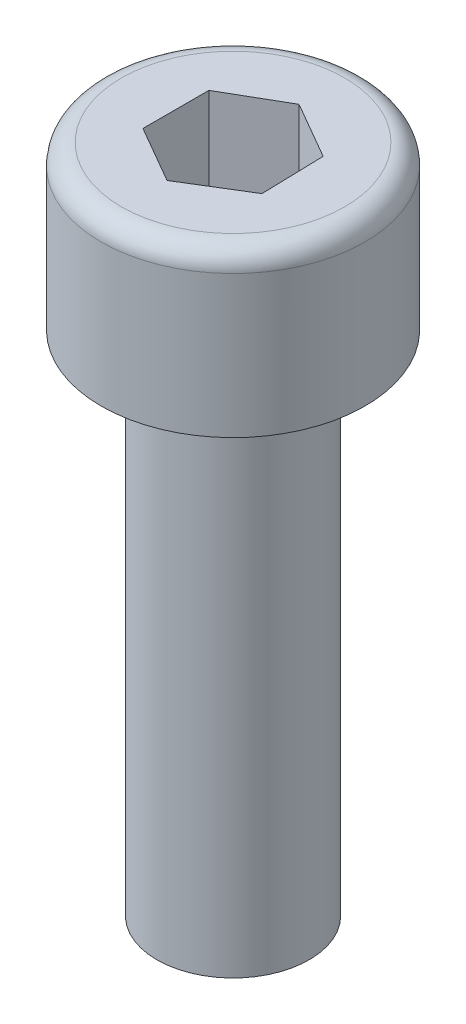
ISO-10303-21;
HEADER;
FILE_DESCRIPTION(('STEP AP214'),'2;1');
FILE_NAME('part.step','',(''),(''),'','','');
FILE_SCHEMA(('AUTOMOTIVE_DESIGN { 1 0 10303 214 1 1 1 1 }'));
ENDSEC;
DATA;
#1=APPLICATION_CONTEXT('core data for automotive mechanical design processes');
#2=APPLICATION_PROTOCOL_DEFINITION('international standard','automotive_design',2000,#1);
#3=PRODUCT_CONTEXT('',#1,'mechanical');
#4=PRODUCT('Part','Part','',(#3));
#5=PRODUCT_RELATED_PRODUCT_CATEGORY('part','',(#4));
#6=PRODUCT_DEFINITION_FORMATION('','',#4);
#7=PRODUCT_DEFINITION_CONTEXT('part definition',#1,'design');
#8=PRODUCT_DEFINITION('design','',#6,#7);
#9=PRODUCT_DEFINITION_SHAPE('','',#8);
#10=(LENGTH_UNIT() NAMED_UNIT(*) SI_UNIT(.MILLI.,.METRE.));
#11=(NAMED_UNIT(*) PLANE_ANGLE_UNIT() SI_UNIT($,.RADIAN.));
#12=(NAMED_UNIT(*) SI_UNIT($,.STERADIAN.) SOLID_ANGLE_UNIT());
#13=UNCERTAINTY_MEASURE_WITH_UNIT(LENGTH_MEASURE(1.E-05),#10,'distance_accuracy_value','');
#14=(GEOMETRIC_REPRESENTATION_CONTEXT(3) GLOBAL_UNCERTAINTY_ASSIGNED_CONTEXT((#13)) GLOBAL_UNIT_ASSIGNED_CONTEXT((#10,
#11,#12)) REPRESENTATION_CONTEXT('',''));
#15=CARTESIAN_POINT('',(0.,0.,0.));
#16=DIRECTION('',(0.,0.,1.));
#17=DIRECTION('',(1.,0.,0.));
#18=AXIS2_PLACEMENT_3D('',#15,#16,#17);
#19=CARTESIAN_POINT('',(11.9109744,13.97,-5.9534006115265));
#20=DIRECTION('',(-0.852405240332367,0.,0.52288173256858));
#21=DIRECTION('',(0.52288173256858,0.,0.852405240332367));
#22=AXIS2_PLACEMENT_3D('',#19,#20,#21);
#23=CYLINDRICAL_SURFACE('',#22,0.254);
#24=DIRECTION('',(0.852405240332363,0.,-0.522881732568586));
#25=VECTOR('',#24,1.);
#26=CARTESIAN_POINT('',(-0.00393560592630098,13.716,1.35543384011064));
#27=LINE('',#26,#25);
#28=CARTESIAN_POINT('',(-0.00393560592625659,13.716,1.35543384011064));
#29=VERTEX_POINT('',#28);
#30=CARTESIAN_POINT('',(1.21391033528552,13.716,0.608383768604798));
#31=VERTEX_POINT('',#30);
#32=EDGE_CURVE('E102',#29,#31,#27,.T.);
#33=ORIENTED_EDGE('',*,*,#32,.F.);
#34=CARTESIAN_POINT('',(-0.00393560592625367,13.97,1.35543384011086));
#35=DIRECTION('',(-0.999911360754317,0.,0.0133143018762043));
#36=DIRECTION('',(-0.0133143018762043,0.,-0.999911360754317));
#37=AXIS2_PLACEMENT_3D('',#34,#35,#36);
#38=ELLIPSE('',#37,0.295592360973203,0.254);
#39=CARTESIAN_POINT('',(0.,13.97,1.65100000000006));
#40=VERTEX_POINT('',#39);
#41=EDGE_CURVE('E89',#29,#40,#38,.T.);
#42=ORIENTED_EDGE('',*,*,#41,.T.);
#43=DIRECTION('',(0.852405240332367,0.,-0.52288173256858));
#44=VECTOR('',#43,1.);
#45=CARTESIAN_POINT('',(0.,13.97,1.651));
#46=LINE('',#45,#44);
#47=CARTESIAN_POINT('',(1.47172493967895,13.97,0.748215678749813));
#48=VERTEX_POINT('',#47);
#49=EDGE_CURVE('E114',#40,#48,#46,.T.);
#50=ORIENTED_EDGE('',*,*,#49,.T.);
#51=CARTESIAN_POINT('',(1.21391033528553,13.97,0.608383768604804));
#52=DIRECTION('',(-0.476763726162514,0.,0.879031483745398));
#53=DIRECTION('',(0.879031483745398,0.,0.476763726162514));
#54=AXIS2_PLACEMENT_3D('',#51,#52,#53);
#55=ELLIPSE('',#54,0.293293936748331,0.254);
#56=EDGE_CURVE('E99',#48,#31,#55,.F.);
#57=ORIENTED_EDGE('',*,*,#56,.T.);
#58=EDGE_LOOP('',(#33,#42,#50,#57));
#59=FACE_BOUND('',#58,.T.);
#60=ADVANCED_FACE('F16',(#59),#23,.F.);
#61=CARTESIAN_POINT('',(11.9109744,13.97,8.23451033940206));
#62=DIRECTION('',(-0.866025403784454,0.,-0.499999999999973));
#63=DIRECTION('',(-0.499999999999973,0.,0.866025403784454));
#64=AXIS2_PLACEMENT_3D('',#61,#62,#63);
#65=CYLINDRICAL_SURFACE('',#64,0.254);
#66=DIRECTION('',(0.866025403784514,0.,0.49999999999987));
#67=VECTOR('',#66,1.);
#68=CARTESIAN_POINT('',(-1.17580794164815,13.716,0.678853031625994));
#69=LINE('',#68,#67);
#70=CARTESIAN_POINT('',(-1.17580794164815,13.716,0.678853031625995));
#71=VERTEX_POINT('',#70);
#72=EDGE_CURVE('E93',#71,#29,#69,.T.);
#73=ORIENTED_EDGE('',*,*,#72,.F.);
#74=CARTESIAN_POINT('',(-1.17580794164815,13.97,0.678853031625995));
#75=DIRECTION('',(-0.500000000000013,0.,-0.866025403784431));
#76=DIRECTION('',(0.866025403784431,0.,-0.500000000000013));
#77=AXIS2_PLACEMENT_3D('',#74,#75,#76);
#78=ELLIPSE('',#77,0.293293936748332,0.254);
#79=CARTESIAN_POINT('',(-1.42980794164807,13.97,0.825500000000124));
#80=VERTEX_POINT('',#79);
#81=EDGE_CURVE('E138',#71,#80,#78,.T.);
#82=ORIENTED_EDGE('',*,*,#81,.T.);
#83=DIRECTION('',(0.866025403784454,0.,0.499999999999973));
#84=VECTOR('',#83,1.);
#85=CARTESIAN_POINT('',(-1.42980794164815,13.97,0.8255));
#86=LINE('',#85,#84);
#87=EDGE_CURVE('E96',#80,#40,#86,.T.);
#88=ORIENTED_EDGE('',*,*,#87,.T.);
#89=ORIENTED_EDGE('',*,*,#41,.F.);
#90=EDGE_LOOP('',(#73,#82,#88,#89));
#91=FACE_BOUND('',#90,.T.);
#92=ADVANCED_FACE('F91',(#91),#65,.F.);
#93=CARTESIAN_POINT('',(0.8804486313776,13.97,-11.9109744));
#94=DIRECTION('',(0.02662624341304,0.,0.999645458731099));
#95=DIRECTION('',(0.999645458731099,0.,-0.02662624341304));
#96=AXIS2_PLACEMENT_3D('',#93,#94,#95);
#97=CYLINDRICAL_SURFACE('',#96,0.254);
#98=DIRECTION('',(-0.0266262434131087,0.,-0.999645458731097));
#99=VECTOR('',#98,1.);
#100=CARTESIAN_POINT('',(1.21391033528573,13.716,0.608383768604426));
#101=LINE('',#100,#99);
#102=CARTESIAN_POINT('',(1.17968349772608,13.716,-0.676615478280665));
#103=VERTEX_POINT('',#102);
#104=EDGE_CURVE('E106',#31,#103,#101,.T.);
#105=ORIENTED_EDGE('',*,*,#104,.F.);
#106=ORIENTED_EDGE('',*,*,#56,.F.);
#107=DIRECTION('',(-0.02662624341304,0.,-0.999645458731099));
#108=VECTOR('',#107,1.);
#109=CARTESIAN_POINT('',(1.47172493967911,13.97,0.748215678749546));
#110=LINE('',#109,#108);
#111=CARTESIAN_POINT('',(1.42980794164829,13.97,-0.825499999999559));
#112=VERTEX_POINT('',#111);
#113=EDGE_CURVE('E136',#48,#112,#110,.T.);
#114=ORIENTED_EDGE('',*,*,#113,.T.);
#115=CARTESIAN_POINT('',(1.17968349772598,13.97,-0.676615478280327));
#116=DIRECTION('',(0.51148620403559,0.,0.859291489007812));
#117=DIRECTION('',(0.859291489007812,0.,-0.51148620403559));
#118=AXIS2_PLACEMENT_3D('',#115,#116,#117);
#119=ELLIPSE('',#118,0.291082184708723,0.254);
#120=EDGE_CURVE('E133',#112,#103,#119,.F.);
#121=ORIENTED_EDGE('',*,*,#120,.T.);
#122=EDGE_LOOP('',(#105,#106,#114,#121));
#123=FACE_BOUND('',#122,.T.);
#124=ADVANCED_FACE('F180',(#123),#97,.F.);
#125=CARTESIAN_POINT('',(0.,16.764,1.651));
#126=DIRECTION('',(0.52288173256858,0.,0.852405240332367));
#127=DIRECTION('',(0.852405240332367,0.,-0.52288173256858));
#128=AXIS2_PLACEMENT_3D('',#125,#126,#127);
#129=PLANE('',#128);
#130=DIRECTION('',(0.852405240332367,0.,-0.52288173256858));
#131=VECTOR('',#130,1.);
#132=CARTESIAN_POINT('',(0.,16.764,1.651));
#133=LINE('',#132,#131);
#134=CARTESIAN_POINT('',(1.47172493967911,16.764,0.748215678749543));
#135=VERTEX_POINT('',#134);
#136=CARTESIAN_POINT('',(0.,16.764,1.65099999999999));
#137=VERTEX_POINT('',#136);
#138=EDGE_CURVE('E112',#135,#137,#133,.F.);
#139=ORIENTED_EDGE('',*,*,#138,.F.);
#140=DIRECTION('',(0.,1.,0.));
#141=VECTOR('',#140,1.);
#142=CARTESIAN_POINT('',(1.47172493967911,16.764,0.748215678749546));
#143=LINE('',#142,#141);
#144=EDGE_CURVE('E142',#135,#48,#143,.F.);
#145=ORIENTED_EDGE('',*,*,#144,.T.);
#146=ORIENTED_EDGE('',*,*,#49,.F.);
#147=DIRECTION('',(0.,1.,0.));
#148=VECTOR('',#147,1.);
#149=CARTESIAN_POINT('',(0.,16.764,1.65099999999997));
#150=LINE('',#149,#148);
#151=EDGE_CURVE('E117',#40,#137,#150,.T.);
#152=ORIENTED_EDGE('',*,*,#151,.T.);
#153=EDGE_LOOP('',(#139,#145,#146,#152));
#154=FACE_BOUND('',#153,.T.);
#155=ADVANCED_FACE('F371',(#154),#129,.F.);
#156=CARTESIAN_POINT('',(0.,13.716,0.));
#157=DIRECTION('',(0.,1.,0.));
#158=DIRECTION('',(0.,0.,1.));
#159=AXIS2_PLACEMENT_3D('',#156,#157,#158);
#160=PLANE('',#159);
#161=ORIENTED_EDGE('',*,*,#32,.T.);
#162=ORIENTED_EDGE('',*,*,#104,.T.);
#163=DIRECTION('',(0.866025403784429,0.,0.500000000000017));
#164=VECTOR('',#163,1.);
#165=CARTESIAN_POINT('',(-11.9109743999997,13.716,-8.23451033940256));
#166=LINE('',#165,#164);
#167=CARTESIAN_POINT('',(-4.28476698566271E-13,13.716,-1.35770606325149));
#168=VERTEX_POINT('',#167);
#169=EDGE_CURVE('E137',#103,#168,#166,.F.);
#170=ORIENTED_EDGE('',*,*,#169,.T.);
#171=DIRECTION('',(0.866025403784429,0.,-0.500000000000017));
#172=VECTOR('',#171,1.);
#173=CARTESIAN_POINT('',(-11.9109743999999,13.716,5.51909821289926));
#174=LINE('',#173,#172);
#175=CARTESIAN_POINT('',(-1.17580794164805,13.716,-0.678853031626008));
#176=VERTEX_POINT('',#175);
#177=EDGE_CURVE('E132',#168,#176,#174,.F.);
#178=ORIENTED_EDGE('',*,*,#177,.T.);
#179=DIRECTION('',(0.,0.,-1.));
#180=VECTOR('',#179,1.);
#181=CARTESIAN_POINT('',(-1.17580794164815,13.716,11.9109744));
#182=LINE('',#181,#180);
#183=EDGE_CURVE('E110',#176,#71,#182,.F.);
#184=ORIENTED_EDGE('',*,*,#183,.T.);
#185=ORIENTED_EDGE('',*,*,#72,.T.);
#186=EDGE_LOOP('',(#161,#162,#170,#178,#184,#185));
#187=FACE_BOUND('',#186,.T.);
#188=ADVANCED_FACE('F108',(#187),#160,.T.);
#189=CARTESIAN_POINT('',(-1.17580794164815,13.97,11.9109744));
#190=DIRECTION('',(0.,0.,-1.));
#191=DIRECTION('',(-1.,0.,0.));
#192=AXIS2_PLACEMENT_3D('',#189,#190,#191);
#193=CYLINDRICAL_SURFACE('',#192,0.254);
#194=ORIENTED_EDGE('',*,*,#183,.F.);
#195=CARTESIAN_POINT('',(-1.17580794164815,13.97,-0.678853031626061));
#196=DIRECTION('',(0.499999999999992,0.,-0.866025403784443));
#197=DIRECTION('',(0.866025403784444,0.,0.499999999999992));
#198=AXIS2_PLACEMENT_3D('',#195,#196,#197);
#199=ELLIPSE('',#198,0.293293936748328,0.254);
#200=CARTESIAN_POINT('',(-1.42980794164802,13.97,-0.825500000000152));
#201=VERTEX_POINT('',#200);
#202=EDGE_CURVE('E130',#176,#201,#199,.T.);
#203=ORIENTED_EDGE('',*,*,#202,.T.);
#204=DIRECTION('',(0.,0.,1.));
#205=VECTOR('',#204,1.);
#206=CARTESIAN_POINT('',(-1.42980794164815,13.97,-0.8255));
#207=LINE('',#206,#205);
#208=EDGE_CURVE('E129',#201,#80,#207,.T.);
#209=ORIENTED_EDGE('',*,*,#208,.T.);
#210=ORIENTED_EDGE('',*,*,#81,.F.);
#211=EDGE_LOOP('',(#194,#203,#209,#210));
#212=FACE_BOUND('',#211,.T.);
#213=ADVANCED_FACE('F354',(#212),#193,.F.);
#214=CARTESIAN_POINT('',(-1.42980794164815,16.764,0.8255));
#215=DIRECTION('',(-0.499999999999973,0.,0.866025403784454));
#216=DIRECTION('',(0.866025403784454,0.,0.499999999999973));
#217=AXIS2_PLACEMENT_3D('',#214,#215,#216);
#218=PLANE('',#217);
#219=DIRECTION('',(0.866025403784454,0.,0.499999999999973));
#220=VECTOR('',#219,1.);
#221=CARTESIAN_POINT('',(-1.42980794164815,16.764,0.8255));
#222=LINE('',#221,#220);
#223=CARTESIAN_POINT('',(-1.42980794164815,16.764,0.8255));
#224=VERTEX_POINT('',#223);
#225=EDGE_CURVE('E146',#137,#224,#222,.F.);
#226=ORIENTED_EDGE('',*,*,#225,.F.);
#227=ORIENTED_EDGE('',*,*,#151,.F.);
#228=ORIENTED_EDGE('',*,*,#87,.F.);
#229=DIRECTION('',(0.,1.,0.));
#230=VECTOR('',#229,1.);
#231=CARTESIAN_POINT('',(-1.42980794164815,16.764,0.8255));
#232=LINE('',#231,#230);
#233=EDGE_CURVE('E149',#80,#224,#232,.T.);
#234=ORIENTED_EDGE('',*,*,#233,.T.);
#235=EDGE_LOOP('',(#226,#227,#228,#234));
#236=FACE_BOUND('',#235,.T.);
#237=ADVANCED_FACE('F345',(#236),#218,.F.);
#238=CARTESIAN_POINT('',(-11.9109744,13.97,-8.23451033940206));
#239=DIRECTION('',(0.866025403784429,0.,0.500000000000017));
#240=DIRECTION('',(0.500000000000017,0.,-0.866025403784429));
#241=AXIS2_PLACEMENT_3D('',#238,#239,#240);
#242=CYLINDRICAL_SURFACE('',#241,0.254);
#243=DIRECTION('',(-0.866025403784429,0.,-0.500000000000017));
#244=VECTOR('',#243,1.);
#245=CARTESIAN_POINT('',(1.42980794164815,13.97,-0.8255));
#246=LINE('',#245,#244);
#247=CARTESIAN_POINT('',(-3.7988597243216E-13,13.97,-1.65100000000028));
#248=VERTEX_POINT('',#247);
#249=EDGE_CURVE('E157',#112,#248,#246,.T.);
#250=ORIENTED_EDGE('',*,*,#249,.T.);
#251=CARTESIAN_POINT('',(-8.10983225019157E-13,13.97,-1.35770606325148));
#252=DIRECTION('',(1.,0.,0.));
#253=DIRECTION('',(0.,0.,-1.));
#254=AXIS2_PLACEMENT_3D('',#251,#252,#253);
#255=ELLIPSE('',#254,0.293293936748333,0.254);
#256=EDGE_CURVE('E126',#248,#168,#255,.F.);
#257=ORIENTED_EDGE('',*,*,#256,.T.);
#258=ORIENTED_EDGE('',*,*,#169,.F.);
#259=ORIENTED_EDGE('',*,*,#120,.F.);
#260=EDGE_LOOP('',(#250,#257,#258,#259));
#261=FACE_BOUND('',#260,.T.);
#262=ADVANCED_FACE('F186',(#261),#242,.F.);
#263=CARTESIAN_POINT('',(1.47172493967911,16.764,0.748215678749546));
#264=DIRECTION('',(0.999645458731099,0.,-0.02662624341304));
#265=DIRECTION('',(-0.02662624341304,0.,-0.999645458731099));
#266=AXIS2_PLACEMENT_3D('',#263,#264,#265);
#267=PLANE('',#266);
#268=DIRECTION('',(-0.02662624341304,0.,-0.999645458731099));
#269=VECTOR('',#268,1.);
#270=CARTESIAN_POINT('',(1.47172493967911,16.764,0.748215678749546));
#271=LINE('',#270,#269);
#272=CARTESIAN_POINT('',(1.42980794164814,16.764,-0.8255));
#273=VERTEX_POINT('',#272);
#274=EDGE_CURVE('E171',#273,#135,#271,.F.);
#275=ORIENTED_EDGE('',*,*,#274,.F.);
#276=DIRECTION('',(0.,1.,0.));
#277=VECTOR('',#276,1.);
#278=CARTESIAN_POINT('',(1.42980794164815,16.764,-0.8255));
#279=LINE('',#278,#277);
#280=EDGE_CURVE('E174',#273,#112,#279,.F.);
#281=ORIENTED_EDGE('',*,*,#280,.T.);
#282=ORIENTED_EDGE('',*,*,#113,.F.);
#283=ORIENTED_EDGE('',*,*,#144,.F.);
#284=EDGE_LOOP('',(#275,#281,#282,#283));
#285=FACE_BOUND('',#284,.T.);
#286=ADVANCED_FACE('F191',(#285),#267,.F.);
#287=CARTESIAN_POINT('',(-11.9109744,13.97,5.5190982128991));
#288=DIRECTION('',(0.866025403784429,0.,-0.500000000000017));
#289=DIRECTION('',(-0.500000000000017,0.,-0.866025403784429));
#290=AXIS2_PLACEMENT_3D('',#287,#288,#289);
#291=CYLINDRICAL_SURFACE('',#290,0.254);
#292=DIRECTION('',(-0.866025403784429,0.,0.500000000000017));
#293=VECTOR('',#292,1.);
#294=CARTESIAN_POINT('',(0.,13.97,-1.651));
#295=LINE('',#294,#293);
#296=EDGE_CURVE('E165',#248,#201,#295,.T.);
#297=ORIENTED_EDGE('',*,*,#296,.T.);
#298=ORIENTED_EDGE('',*,*,#202,.F.);
#299=ORIENTED_EDGE('',*,*,#177,.F.);
#300=ORIENTED_EDGE('',*,*,#256,.F.);
#301=EDGE_LOOP('',(#297,#298,#299,#300));
#302=FACE_BOUND('',#301,.T.);
#303=ADVANCED_FACE('F257',(#302),#291,.F.);
#304=CARTESIAN_POINT('',(-1.42980794164815,16.764,-0.8255));
#305=DIRECTION('',(-1.,0.,0.));
#306=DIRECTION('',(0.,0.,1.));
#307=AXIS2_PLACEMENT_3D('',#304,#305,#306);
#308=PLANE('',#307);
#309=DIRECTION('',(0.,0.,1.));
#310=VECTOR('',#309,1.);
#311=CARTESIAN_POINT('',(-1.42980794164815,16.764,-0.8255));
#312=LINE('',#311,#310);
#313=CARTESIAN_POINT('',(-1.42980794164814,16.764,-0.825499999999989));
#314=VERTEX_POINT('',#313);
#315=EDGE_CURVE('E151',#224,#314,#312,.F.);
#316=ORIENTED_EDGE('',*,*,#315,.F.);
#317=ORIENTED_EDGE('',*,*,#233,.F.);
#318=ORIENTED_EDGE('',*,*,#208,.F.);
#319=DIRECTION('',(0.,1.,0.));
#320=VECTOR('',#319,1.);
#321=CARTESIAN_POINT('',(-1.42980794164812,16.764,-0.825499999999956));
#322=LINE('',#321,#320);
#323=EDGE_CURVE('E167',#201,#314,#322,.T.);
#324=ORIENTED_EDGE('',*,*,#323,.T.);
#325=EDGE_LOOP('',(#316,#317,#318,#324));
#326=FACE_BOUND('',#325,.T.);
#327=ADVANCED_FACE('F260',(#326),#308,.F.);
#328=CARTESIAN_POINT('',(1.42980794164815,16.764,-0.8255));
#329=DIRECTION('',(0.500000000000017,0.,-0.866025403784429));
#330=DIRECTION('',(-0.866025403784429,0.,-0.500000000000017));
#331=AXIS2_PLACEMENT_3D('',#328,#329,#330);
#332=PLANE('',#331);
#333=DIRECTION('',(-0.866025403784429,0.,-0.500000000000017));
#334=VECTOR('',#333,1.);
#335=CARTESIAN_POINT('',(1.42980794164815,16.764,-0.8255));
#336=LINE('',#335,#334);
#337=CARTESIAN_POINT('',(0.,16.764,-1.65100000000002));
#338=VERTEX_POINT('',#337);
#339=EDGE_CURVE('E176',#338,#273,#336,.F.);
#340=ORIENTED_EDGE('',*,*,#339,.F.);
#341=DIRECTION('',(0.,1.,0.));
#342=VECTOR('',#341,1.);
#343=CARTESIAN_POINT('',(0.,16.764,-1.651));
#344=LINE('',#343,#342);
#345=EDGE_CURVE('E170',#338,#248,#344,.F.);
#346=ORIENTED_EDGE('',*,*,#345,.T.);
#347=ORIENTED_EDGE('',*,*,#249,.F.);
#348=ORIENTED_EDGE('',*,*,#280,.F.);
#349=EDGE_LOOP('',(#340,#346,#347,#348));
#350=FACE_BOUND('',#349,.T.);
#351=ADVANCED_FACE('F195',(#350),#332,.F.);
#352=CARTESIAN_POINT('',(0.,16.764,-1.651));
#353=DIRECTION('',(-0.500000000000017,0.,-0.866025403784429));
#354=DIRECTION('',(-0.866025403784429,0.,0.500000000000017));
#355=AXIS2_PLACEMENT_3D('',#352,#353,#354);
#356=PLANE('',#355);
#357=DIRECTION('',(0.866025403784444,0.,-0.49999999999999));
#358=VECTOR('',#357,1.);
#359=CARTESIAN_POINT('',(-1.42980794164815,16.764,-0.8255));
#360=LINE('',#359,#358);
#361=EDGE_CURVE('E201',#314,#338,#360,.T.);
#362=ORIENTED_EDGE('',*,*,#361,.F.);
#363=ORIENTED_EDGE('',*,*,#323,.F.);
#364=ORIENTED_EDGE('',*,*,#296,.F.);
#365=ORIENTED_EDGE('',*,*,#345,.F.);
#366=EDGE_LOOP('',(#362,#363,#364,#365));
#367=FACE_BOUND('',#366,.T.);
#368=ADVANCED_FACE('F253',(#367),#356,.F.);
#369=CARTESIAN_POINT('',(0.,16.764,0.));
#370=DIRECTION('',(0.,1.,0.));
#371=DIRECTION('',(0.,0.,1.));
#372=AXIS2_PLACEMENT_3D('',#369,#370,#371);
#373=PLANE('',#372);
#374=ORIENTED_EDGE('',*,*,#315,.T.);
#375=ORIENTED_EDGE('',*,*,#361,.T.);
#376=ORIENTED_EDGE('',*,*,#339,.T.);
#377=ORIENTED_EDGE('',*,*,#274,.T.);
#378=ORIENTED_EDGE('',*,*,#138,.T.);
#379=ORIENTED_EDGE('',*,*,#225,.T.);
#380=EDGE_LOOP('',(#374,#375,#376,#377,#378,#379));
#381=FACE_BOUND('',#380,.T.);
#382=CARTESIAN_POINT('',(0.,16.764,0.));
#383=DIRECTION('',(0.,-1.,0.));
#384=DIRECTION('',(1.,0.,0.));
#385=AXIS2_PLACEMENT_3D('',#382,#383,#384);
#386=CIRCLE('',#385,2.794);
#387=CARTESIAN_POINT('',(2.794,16.764,0.));
#388=VERTEX_POINT('',#387);
#389=CARTESIAN_POINT('',(-2.794,16.764,0.));
#390=VERTEX_POINT('',#389);
#391=EDGE_CURVE('E229',#388,#390,#386,.T.);
#392=ORIENTED_EDGE('',*,*,#391,.F.);
#393=CARTESIAN_POINT('',(-2.794,16.764,0.));
#394=CARTESIAN_POINT('',(-2.79400089483734,16.7640000000122,-0.00832229323401432));
#395=CARTESIAN_POINT('',(-2.79396502160088,16.7640000000075,-0.0166447926784361));
#396=CARTESIAN_POINT('',(-2.79357059178499,16.7639999998878,-0.0617796976085188));
#397=CARTESIAN_POINT('',(-2.79252778719085,16.7639999994507,-0.0985889019264999));
#398=CARTESIAN_POINT('',(-2.78905580218247,16.7639999978548,-0.170664338853865));
#399=CARTESIAN_POINT('',(-2.78668373581463,16.7639999967254,-0.205933404638414));
#400=CARTESIAN_POINT('',(-2.78012577401682,16.763999993538,-0.281896860011656));
#401=CARTESIAN_POINT('',(-2.77571325254175,16.7639999913617,-0.322571961935812));
#402=CARTESIAN_POINT('',(-2.76538766494508,16.7639999861822,-0.401538984761907));
#403=CARTESIAN_POINT('',(-2.75956650341595,16.7639999832288,-0.439842976553902));
#404=CARTESIAN_POINT('',(-2.74670706885264,16.7639999766132,-0.51403996941802));
#405=CARTESIAN_POINT('',(-2.73975513223043,16.7639999729999,-0.549947942002885));
#406=CARTESIAN_POINT('',(-2.7249011111535,16.7639999651752,-0.619343380212663));
#407=CARTESIAN_POINT('',(-2.71707977997489,16.7639999610121,-0.652848150088556));
#408=CARTESIAN_POINT('',(-2.70073721224506,16.7639999521937,-0.717444295044448));
#409=CARTESIAN_POINT('',(-2.69229114306644,16.763999947586,-0.748554700865713));
#410=CARTESIAN_POINT('',(-2.67493206256394,16.7639999379797,-0.808382427020132));
#411=CARTESIAN_POINT('',(-2.66608866682524,16.7639999330282,-0.837119965883143));
#412=CARTESIAN_POINT('',(-2.64815022313542,16.7639999228266,-0.892233246426438));
#413=CARTESIAN_POINT('',(-2.63911931145847,16.7639999176238,-0.91862986018169));
#414=CARTESIAN_POINT('',(-2.62100410938807,16.7639999070178,-0.969099452317695));
#415=CARTESIAN_POINT('',(-2.61197852002152,16.7639999016615,-0.993193574976784));
#416=CARTESIAN_POINT('',(-2.58627447642498,16.7639998860912,-1.05902940852583));
#417=CARTESIAN_POINT('',(-2.56891596059646,16.7639998752375,-1.10050828612579));
#418=CARTESIAN_POINT('',(-2.53576070044917,16.7639998536927,-1.17465990982054));
#419=CARTESIAN_POINT('',(-2.52030877829811,16.7639998433742,-1.20748767382108));
#420=CARTESIAN_POINT('',(-2.49198630700297,16.7639998225255,-1.26474340007265));
#421=CARTESIAN_POINT('',(-2.47938185139609,16.7639998126356,-1.28930313421621));
#422=CARTESIAN_POINT('',(-2.4575255143911,16.7639997951013,-1.33038073443859));
#423=CARTESIAN_POINT('',(-2.44846477141358,16.7639997877278,-1.34700047935243));
#424=CARTESIAN_POINT('',(-2.4338647652274,16.7639997703461,-1.37315689092044));
#425=CARTESIAN_POINT('',(-2.42843421852287,16.7639997627222,-1.38275450583298));
#426=CARTESIAN_POINT('',(-2.40143690024607,16.7639997177933,-1.42982604922331));
#427=CARTESIAN_POINT('',(-2.37906696787528,16.7639996588351,-1.46684472623898));
#428=CARTESIAN_POINT('',(-2.32861047188455,16.7639995810909,-1.54603851385344));
#429=CARTESIAN_POINT('',(-2.30020165174426,16.7639995709347,-1.58800839635313));
#430=CARTESIAN_POINT('',(-2.24111775962928,16.7639995964999,-1.670319412759));
#431=CARTESIAN_POINT('',(-2.21044274340502,16.7639996322202,-1.71066058669514));
#432=CARTESIAN_POINT('',(-2.14692236138997,16.763999737279,-1.78959149520615));
#433=CARTESIAN_POINT('',(-2.11407713783072,16.7639998066155,-1.8281813442807));
#434=CARTESIAN_POINT('',(-2.04182585494066,16.7639999382895,-1.90843411817932));
#435=CARTESIAN_POINT('',(-2.00212535751761,16.7639999985037,-1.94983267746146));
#436=CARTESIAN_POINT('',(-1.92970138342342,16.7640000011516,-2.02092672015847));
#437=CARTESIAN_POINT('',(-1.89746938264675,16.7639999674577,-2.0511265046922));
#438=CARTESIAN_POINT('',(-1.82670022106518,16.7639999818868,-2.11453304182926));
#439=CARTESIAN_POINT('',(-1.78794835322044,16.7640000431977,-2.14750090648753));
#440=CARTESIAN_POINT('',(-1.72368640905983,16.76399995885,-2.19943608731194));
#441=CARTESIAN_POINT('',(-1.69866687197989,16.7639998822515,-2.21901294015506));
#442=CARTESIAN_POINT('',(-1.66598326776359,16.7639997243682,-2.24365513223086));
#443=CARTESIAN_POINT('',(-1.65863307076904,16.7639996851731,-2.24913747287669));
#444=CARTESIAN_POINT('',(-1.63709431687459,16.7639995985317,-2.26500527560066));
#445=CARTESIAN_POINT('',(-1.62281952078143,16.7639995765148,-2.27527388413513));
#446=CARTESIAN_POINT('',(-1.58905548766279,16.7639995438774,-2.299065612604));
#447=CARTESIAN_POINT('',(-1.56948525569348,16.7639995399168,-2.31247369799334));
#448=CARTESIAN_POINT('',(-1.52164730535644,16.763999555705,-2.34433824346034));
#449=CARTESIAN_POINT('',(-1.49320316617359,16.7639995861949,-2.36253032271863));
#450=CARTESIAN_POINT('',(-1.42913861361945,16.7639996698178,-2.40186507528954));
#451=CARTESIAN_POINT('',(-1.39335387568778,16.7639997265182,-2.4227410470638));
#452=CARTESIAN_POINT('',(-1.33762357031923,16.7639997992459,-2.45361473404897));
#453=CARTESIAN_POINT('',(-1.31799256294615,16.7639998219657,-2.46418517514572));
#454=CARTESIAN_POINT('',(-1.27172746540885,16.7639998652978,-2.48839626404895));
#455=CARTESIAN_POINT('',(-1.24499518430577,16.7639998825298,-2.5018500809019));
#456=CARTESIAN_POINT('',(-1.18664993818967,16.7639999136699,-2.5300544190762));
#457=CARTESIAN_POINT('',(-1.15496223538062,16.763999926554,-2.54465039629353));
#458=CARTESIAN_POINT('',(-1.08652258026415,16.7639999487043,-2.57464072078276));
#459=CARTESIAN_POINT('',(-1.04969100023533,16.7639999571959,-2.58985366012732));
#460=CARTESIAN_POINT('',(-0.97079071063902,16.763999971595,-2.62048928917544));
#461=CARTESIAN_POINT('',(-0.928640640330615,16.7639999770493,-2.6357025039038));
#462=CARTESIAN_POINT('',(-0.838953264911469,16.7639999859503,-2.66566004440296));
#463=CARTESIAN_POINT('',(-0.791335962757136,16.763999989108,-2.6801661874786));
#464=CARTESIAN_POINT('',(-0.717593399658393,16.7639999927268,-2.70049862316906));
#465=CARTESIAN_POINT('',(-0.691715608638451,16.7639999937596,-2.70723599266082));
#466=CARTESIAN_POINT('',(-0.638572753186537,16.7639999955218,-2.72026138631128));
#467=CARTESIAN_POINT('',(-0.611298991427341,16.7639999962349,-2.72651409976672));
#468=CARTESIAN_POINT('',(-0.555364027426091,16.7639999974287,-2.73845718146199));
#469=CARTESIAN_POINT('',(-0.52669489089734,16.7639999978977,-2.74411036166879));
#470=CARTESIAN_POINT('',(-0.467973637760126,16.7639999986609,-2.75473630253902));
#471=CARTESIAN_POINT('',(-0.437914449184524,16.7639999989469,-2.75967002142081));
#472=CARTESIAN_POINT('',(-0.376424509839774,16.7639999993953,-2.76873356904576));
#473=CARTESIAN_POINT('',(-0.344987727370973,16.7639999995521,-2.77282250889378));
#474=CARTESIAN_POINT('',(-0.280761505596255,16.7639999997843,-2.78006807525279));
#475=CARTESIAN_POINT('',(-0.247967245701143,16.7639999998564,-2.78318198869288));
#476=CARTESIAN_POINT('',(-0.177999249843934,16.7639999999577,-2.78858005930551));
#477=CARTESIAN_POINT('',(-0.140812992965906,16.7639999999802,-2.79070270376351));
#478=CARTESIAN_POINT('',(-0.064918218392772,16.7640000000024,-2.79351499463756));
#479=CARTESIAN_POINT('',(-0.026207442097294,16.7640000000012,-2.79414489489543));
#480=CARTESIAN_POINT('',(0.0338613475862987,16.7639999999966,-2.79387457389788));
#481=CARTESIAN_POINT('',(0.0552232778629475,16.7639999999945,-2.793533463316));
#482=CARTESIAN_POINT('',(0.0979335270617541,16.763999999989,-2.79236146567032));
#483=CARTESIAN_POINT('',(0.119281845991039,16.7639999999857,-2.79153057886319));
#484=CARTESIAN_POINT('',(0.18740069526536,16.7639999999744,-2.78809643654425));
#485=CARTESIAN_POINT('',(0.234127810017632,16.7639999999657,-2.78456120645599));
#486=CARTESIAN_POINT('',(0.32734281981593,16.7639999999505,-2.7751464151898));
#487=CARTESIAN_POINT('',(0.373830715013633,16.763999999944,-2.76926685549846));
#488=CARTESIAN_POINT('',(0.46645276296709,16.7639999999361,-2.75517820542519));
#489=CARTESIAN_POINT('',(0.512586915822057,16.7639999999345,-2.74696911569664));
#490=CARTESIAN_POINT('',(0.604384190437243,16.7639999999365,-2.72824217090966));
#491=CARTESIAN_POINT('',(0.650047312162998,16.76399999994,-2.7177243156823));
#492=CARTESIAN_POINT('',(0.74078665977652,16.7639999999524,-2.69440646256474));
#493=CARTESIAN_POINT('',(0.785862885413784,16.7639999999613,-2.6816064637005));
#494=CARTESIAN_POINT('',(0.8753167865641,16.7639999999746,-2.65375655032293));
#495=CARTESIAN_POINT('',(0.919694461531935,16.7639999999789,-2.63870663405366));
#496=CARTESIAN_POINT('',(0.988546326888048,16.7639999999977,-2.61340764109714));
#497=CARTESIAN_POINT('',(1.01329906468811,16.7640000000069,-2.60391008093842));
#498=CARTESIAN_POINT('',(1.05835604694763,16.7639999999921,-2.585885836435));
#499=CARTESIAN_POINT('',(1.07870362450604,16.7639999999734,-2.57746719016061));
#500=CARTESIAN_POINT('',(1.14559080321542,16.763999999809,-2.54887273305064));
#501=CARTESIAN_POINT('',(1.19169917252702,16.7639999995294,-2.52767557556992));
#502=CARTESIAN_POINT('',(1.28270456283447,16.763999983255,-2.48282943862539));
#503=CARTESIAN_POINT('',(1.32760155038329,16.7639999672598,-2.45918039155046));
#504=CARTESIAN_POINT('',(1.41606182792271,16.7639998949206,-2.40949189678953));
#505=CARTESIAN_POINT('',(1.45962503932166,16.7639998385742,-2.38345230860301));
#506=CARTESIAN_POINT('',(1.51551271335821,16.7639996991865,-2.34797568377487));
#507=CARTESIAN_POINT('',(1.52850544659835,16.7639996619168,-2.3395780065415));
#508=CARTESIAN_POINT('',(1.57087432239983,16.7639995389571,-2.3116834637311));
#509=CARTESIAN_POINT('',(1.59995084383836,16.7639994523046,-2.29172797382196));
#510=CARTESIAN_POINT('',(1.66987364967902,16.76399932262,-2.24168808213285));
#511=CARTESIAN_POINT('',(1.71028884530354,16.763999315388,-2.2109998999082));
#512=CARTESIAN_POINT('',(1.78935645914718,16.7639994451463,-2.14743624669525));
#513=CARTESIAN_POINT('',(1.82800905034863,16.7639995821224,-2.11456099112875));
#514=CARTESIAN_POINT('',(1.90495130203706,16.763999844598,-2.0451019308863));
#515=CARTESIAN_POINT('',(1.94315117840973,16.7639999693336,-2.00841881973293));
#516=CARTESIAN_POINT('',(2.00062058012645,16.764000016585,-1.95053291766788));
#517=CARTESIAN_POINT('',(2.02052897424356,16.7640000056521,-1.92995554561612));
#518=CARTESIAN_POINT('',(2.05965544998087,16.7639999913796,-1.88825197399685));
#519=CARTESIAN_POINT('',(2.07887518403051,16.7639999880206,-1.86712733177116));
#520=CARTESIAN_POINT('',(2.12303073286347,16.7639999604875,-1.81708946908249));
#521=CARTESIAN_POINT('',(2.14771077215346,16.7639999296819,-1.78795000414132));
#522=CARTESIAN_POINT('',(2.19131144934864,16.7639998572737,-1.73427052454131));
#523=CARTESIAN_POINT('',(2.21044049667028,16.7639998188028,-1.70989944533948));
#524=CARTESIAN_POINT('',(2.24610414652698,16.7639997474868,-1.6628523918672));
#525=CARTESIAN_POINT('',(2.26271341105978,16.763999714453,-1.64023297141017));
#526=CARTESIAN_POINT('',(2.29942914011434,16.7639996554011,-1.58859031815383));
#527=CARTESIAN_POINT('',(2.31933140954657,16.763999633396,-1.5594214689246));
#528=CARTESIAN_POINT('',(2.35555290218284,16.7639996222402,-1.50406788015209));
#529=CARTESIAN_POINT('',(2.37200725373716,16.7639996292922,-1.47797134432003));
#530=CARTESIAN_POINT('',(2.40403483247153,16.763999653838,-1.42524344142879));
#531=CARTESIAN_POINT('',(2.41960807940147,16.7639996713316,-1.39861208637567));
#532=CARTESIAN_POINT('',(2.4471563547093,16.7639997131694,-1.34963792790032));
#533=CARTESIAN_POINT('',(2.45927776442417,16.7639997357354,-1.32737735963056));
#534=CARTESIAN_POINT('',(2.48290275398574,16.7639997845552,-1.28253275521856));
#535=CARTESIAN_POINT('',(2.49440635645013,16.7639998108089,-1.25994873095631));
#536=CARTESIAN_POINT('',(2.52797837044102,16.7639998897762,-1.19173767122743));
#537=CARTESIAN_POINT('',(2.54911211789344,16.7639999427048,-1.14564430629203));
#538=CARTESIAN_POINT('',(2.57931189624085,16.7639999899082,-1.07466692245088));
#539=CARTESIAN_POINT('',(2.58931736064233,16.7640000001264,-1.05017702766713));
#540=CARTESIAN_POINT('',(2.60714846419255,16.7639999998926,-1.00471601542263));
#541=CARTESIAN_POINT('',(2.61507257714888,16.7639999923802,-0.983783494740496));
#542=CARTESIAN_POINT('',(2.63881829644773,16.7639999692098,-0.918790250740469));
#543=CARTESIAN_POINT('',(2.65381835033739,16.7639999536123,-0.874426154857382));
#544=CARTESIAN_POINT('',(2.68164616274556,16.7639999562641,-0.785025553152332));
#545=CARTESIAN_POINT('',(2.69447398764862,16.7639999745124,-0.739989067924759));
#546=CARTESIAN_POINT('',(2.71790174708988,16.7640000139568,-0.649335292765661));
#547=CARTESIAN_POINT('',(2.72850156246049,16.7640000351531,-0.603717971905822));
#548=CARTESIAN_POINT('',(2.74051826687189,16.7639998876112,-0.545920028164417));
#549=CARTESIAN_POINT('',(2.74293274816581,16.7639998476541,-0.533941258731201));
#550=CARTESIAN_POINT('',(2.74863592694953,16.7639997930333,-0.504334279271869));
#551=CARTESIAN_POINT('',(2.7518056219606,16.763999798927,-0.486682984969556));
#552=CARTESIAN_POINT('',(2.75953255490211,16.7639998205468,-0.441120290769301));
#553=CARTESIAN_POINT('',(2.76383501184747,16.7639998399844,-0.413165926910478));
#554=CARTESIAN_POINT('',(2.77330669727111,16.7639998892932,-0.344633207240488));
#555=CARTESIAN_POINT('',(2.7780058223084,16.7639999199493,-0.303988669267507));
#556=CARTESIAN_POINT('',(2.78444589060953,16.7639999590892,-0.235062775709163));
#557=CARTESIAN_POINT('',(2.78665214712009,16.7639999714925,-0.206823679254477));
#558=CARTESIAN_POINT('',(2.78990877720835,16.7639999875355,-0.15506135657108));
#559=CARTESIAN_POINT('',(2.79109137433148,16.7639999923008,-0.131546419961218));
#560=CARTESIAN_POINT('',(2.79333927346576,16.763999999989,-0.0720315330776443));
#561=CARTESIAN_POINT('',(2.79401060963037,16.7640000005987,-0.0360163139357002));
#562=CARTESIAN_POINT('',(2.794,16.764,0.));
#563=B_SPLINE_CURVE_WITH_KNOTS('',3,(#393,#394,#395,#396,#397,#398,#399,#400,#401,#402,#403,
#404,#405,#406,#407,#408,#409,#410,#411,#412,#413,#414,#415,#416,#417,#418,#419,#420,#421,#422,
#423,#424,#425,#426,#427,#428,#429,#430,#431,#432,#433,#434,#435,#436,#437,#438,#439,#440,#441,
#442,#443,#444,#445,#446,#447,#448,#449,#450,#451,#452,#453,#454,#455,#456,#457,#458,#459,#460,
#461,#462,#463,#464,#465,#466,#467,#468,#469,#470,#471,#472,#473,#474,#475,#476,#477,#478,#479,
#480,#481,#482,#483,#484,#485,#486,#487,#488,#489,#490,#491,#492,#493,#494,#495,#496,#497,#498,
#499,#500,#501,#502,#503,#504,#505,#506,#507,#508,#509,#510,#511,#512,#513,#514,#515,#516,#517,
#518,#519,#520,#521,#522,#523,#524,#525,#526,#527,#528,#529,#530,#531,#532,#533,#534,#535,#536,
#537,#538,#539,#540,#541,#542,#543,#544,#545,#546,#547,#548,#549,#550,#551,#552,#553,#554,#555,
#556,#557,#558,#559,#560,#561,#562),.UNSPECIFIED.,.F.,.F.,(4,2,2,2,2,2,2,2,2,2,2,2,2,2,2,2,2,2,
2,2,2,2,2,2,2,2,2,2,2,2,2,2,2,2,2,2,2,2,2,2,2,2,2,2,2,2,2,2,2,2,2,2,2,2,2,2,2,2,2,2,2,2,2,2,2,2,
2,2,2,2,2,2,2,2,2,2,2,2,2,2,2,2,2,2,4),(0.,0.0249673520203295,0.135406726576466,
0.241429238001873,0.364129434061702,0.480327707104107,0.590023664137372,0.693216932366927,
0.789907159196578,0.880094012229688,0.963777179270328,1.04095636832442,1.17579196311121,
1.28461329787653,1.36741699476307,1.42420042232232,1.45728252432938,1.58698899687368,
1.73895308993614,1.89091344579184,2.04286385229434,2.21482083234192,2.34728820791364,
2.49985219014616,2.5951398562118,2.62264815708958,2.67539745132476,2.74655803170461,
2.84782799126572,2.97206841746273,3.03895148914349,3.12871629565395,3.23335551233853,
3.35286797054477,3.48725253142642,3.63650808638741,3.71672037282375,3.80065120861964,
3.88830057532446,3.97966846134857,4.0747548619651,4.17355977931138,4.28527069440747,
4.40138238618531,4.46547126227029,4.52956010477085,4.67007713517841,4.81059407648086,
4.95111097837138,5.09162789054313,5.2321448626893,5.37266194450306,5.45218885006171,
5.51824534810512,5.67040579350141,5.82257043585513,5.97474402719442,6.02115417148871,
6.12692276890737,6.27908037624282,6.43122301852245,6.59001874903392,6.67590585112993,
6.76157078825407,6.8760968624081,6.96902507179915,7.05320032577298,7.15910761356511,
7.25164353945569,7.34417739033983,7.42020802508953,7.49623587448491,7.64826633373683,
7.72762227505143,7.7947635936685,7.93519750419781,8.07562712221161,8.2160642493498,
8.2527224869429,8.30651841279505,8.39135719087619,8.51405849778614,8.59902194140219,
8.66964885703413,8.77768783200806),.UNSPECIFIED.);
#564=EDGE_CURVE('E35',#390,#388,#563,.T.);
#565=ORIENTED_EDGE('',*,*,#564,.F.);
#566=EDGE_LOOP('',(#392,#565));
#567=FACE_BOUND('',#566,.T.);
#568=ADVANCED_FACE('F219',(#381,#567),#373,.T.);
#569=CARTESIAN_POINT('',(0.,16.256,0.));
#570=DIRECTION('',(0.,1.,0.));
#571=DIRECTION('',(-0.999960073470565,0.,-0.00893596467891669));
#572=AXIS2_PLACEMENT_3D('',#569,#570,#571);
#573=TOROIDAL_SURFACE('',#572,2.794,0.508);
#574=CARTESIAN_POINT('',(0.,16.256,0.));
#575=DIRECTION('',(0.,1.,0.));
#576=DIRECTION('',(0.,0.,1.));
#577=AXIS2_PLACEMENT_3D('',#574,#575,#576);
#578=CIRCLE('',#577,3.302);
#579=CARTESIAN_POINT('',(0.,16.256,3.302));
#580=VERTEX_POINT('',#579);
#581=EDGE_CURVE('E125',#580,#580,#578,.F.);
#582=ORIENTED_EDGE('',*,*,#581,.F.);
#583=EDGE_LOOP('',(#582));
#584=FACE_BOUND('',#583,.T.);
#585=ORIENTED_EDGE('',*,*,#391,.T.);
#586=ORIENTED_EDGE('',*,*,#564,.T.);
#587=EDGE_LOOP('',(#585,#586));
#588=FACE_BOUND('',#587,.T.);
#589=ADVANCED_FACE('F207',(#584,#588),#573,.T.);
#590=CARTESIAN_POINT('',(0.,12.7,0.));
#591=DIRECTION('',(0.,1.,0.));
#592=DIRECTION('',(0.,0.,1.));
#593=AXIS2_PLACEMENT_3D('',#590,#591,#592);
#594=CYLINDRICAL_SURFACE('',#593,3.302);
#595=CARTESIAN_POINT('',(0.,12.7,0.));
#596=DIRECTION('',(0.,1.,0.));
#597=DIRECTION('',(0.,0.,1.));
#598=AXIS2_PLACEMENT_3D('',#595,#596,#597);
#599=CIRCLE('',#598,3.302);
#600=CARTESIAN_POINT('',(0.,12.7,3.302));
#601=VERTEX_POINT('',#600);
#602=EDGE_CURVE('E122',#601,#601,#599,.T.);
#603=ORIENTED_EDGE('',*,*,#602,.T.);
#604=EDGE_LOOP('',(#603));
#605=FACE_BOUND('',#604,.T.);
#606=ORIENTED_EDGE('',*,*,#581,.T.);
#607=EDGE_LOOP('',(#606));
#608=FACE_BOUND('',#607,.T.);
#609=ADVANCED_FACE('F218',(#605,#608),#594,.T.);
#610=CARTESIAN_POINT('',(0.,0.,0.));
#611=DIRECTION('',(0.,1.,0.));
#612=DIRECTION('',(0.,0.,1.));
#613=AXIS2_PLACEMENT_3D('',#610,#611,#612);
#614=PLANE('',#613);
#615=CARTESIAN_POINT('',(0.,0.,0.));
#616=DIRECTION('',(0.,1.,0.));
#617=DIRECTION('',(0.,0.,1.));
#618=AXIS2_PLACEMENT_3D('',#615,#616,#617);
#619=CIRCLE('',#618,1.905);
#620=CARTESIAN_POINT('',(0.,0.,1.905));
#621=VERTEX_POINT('',#620);
#622=EDGE_CURVE('E27',#621,#621,#619,.T.);
#623=ORIENTED_EDGE('',*,*,#622,.F.);
#624=EDGE_LOOP('',(#623));
#625=FACE_BOUND('',#624,.T.);
#626=ADVANCED_FACE('F278',(#625),#614,.F.);
#627=CARTESIAN_POINT('',(0.,12.7,0.));
#628=DIRECTION('',(0.,1.,0.));
#629=DIRECTION('',(0.,0.,1.));
#630=AXIS2_PLACEMENT_3D('',#627,#628,#629);
#631=PLANE('',#630);
#632=CARTESIAN_POINT('',(0.,12.7,0.));
#633=DIRECTION('',(0.,1.,0.));
#634=DIRECTION('',(0.,0.,1.));
#635=AXIS2_PLACEMENT_3D('',#632,#633,#634);
#636=CIRCLE('',#635,1.905);
#637=CARTESIAN_POINT('',(0.,12.7,1.905));
#638=VERTEX_POINT('',#637);
#639=EDGE_CURVE('E11',#638,#638,#636,.F.);
#640=ORIENTED_EDGE('',*,*,#639,.F.);
#641=EDGE_LOOP('',(#640));
#642=FACE_BOUND('',#641,.T.);
#643=ORIENTED_EDGE('',*,*,#602,.F.);
#644=EDGE_LOOP('',(#643));
#645=FACE_BOUND('',#644,.T.);
#646=ADVANCED_FACE('F272',(#642,#645),#631,.F.);
#647=CARTESIAN_POINT('',(0.,0.,0.));
#648=DIRECTION('',(0.,1.,0.));
#649=DIRECTION('',(0.,0.,1.));
#650=AXIS2_PLACEMENT_3D('',#647,#648,#649);
#651=CYLINDRICAL_SURFACE('',#650,1.905);
#652=ORIENTED_EDGE('',*,*,#622,.T.);
#653=EDGE_LOOP('',(#652));
#654=FACE_BOUND('',#653,.T.);
#655=ORIENTED_EDGE('',*,*,#639,.T.);
#656=EDGE_LOOP('',(#655));
#657=FACE_BOUND('',#656,.T.);
#658=ADVANCED_FACE('F270',(#654,#657),#651,.T.);
#659=CLOSED_SHELL('',(#60,#92,#124,#155,#188,#213,#237,#262,#286,#303,#327,#351,#368,#568,#589,
#609,#626,#646,#658));
#660=MANIFOLD_SOLID_BREP('B1',#659);
#661=ADVANCED_BREP_SHAPE_REPRESENTATION('',(#18,#660),#14);
#662=SHAPE_DEFINITION_REPRESENTATION(#9,#661);
ENDSEC;
END-ISO-10303-21;
